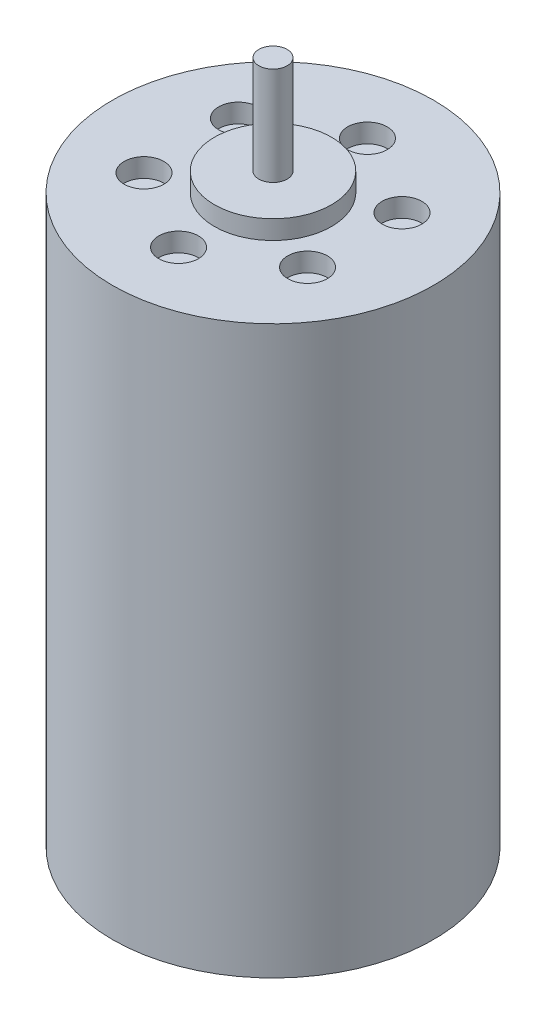
ISO-10303-21;
HEADER;
FILE_DESCRIPTION(('STEP AP214'),'2;1');
FILE_NAME('part.step','',(''),(''),'','','');
FILE_SCHEMA(('AUTOMOTIVE_DESIGN { 1 0 10303 214 1 1 1 1 }'));
ENDSEC;
DATA;
#1=APPLICATION_CONTEXT('core data for automotive mechanical design processes');
#2=APPLICATION_PROTOCOL_DEFINITION('international standard','automotive_design',2000,#1);
#3=PRODUCT_CONTEXT('',#1,'mechanical');
#4=PRODUCT('Part','Part','',(#3));
#5=PRODUCT_RELATED_PRODUCT_CATEGORY('part','',(#4));
#6=PRODUCT_DEFINITION_FORMATION('','',#4);
#7=PRODUCT_DEFINITION_CONTEXT('part definition',#1,'design');
#8=PRODUCT_DEFINITION('design','',#6,#7);
#9=PRODUCT_DEFINITION_SHAPE('','',#8);
#10=(LENGTH_UNIT() NAMED_UNIT(*) SI_UNIT(.MILLI.,.METRE.));
#11=(NAMED_UNIT(*) PLANE_ANGLE_UNIT() SI_UNIT($,.RADIAN.));
#12=(NAMED_UNIT(*) SI_UNIT($,.STERADIAN.) SOLID_ANGLE_UNIT());
#13=UNCERTAINTY_MEASURE_WITH_UNIT(LENGTH_MEASURE(1.E-05),#10,'distance_accuracy_value','');
#14=(GEOMETRIC_REPRESENTATION_CONTEXT(3) GLOBAL_UNCERTAINTY_ASSIGNED_CONTEXT((#13)) GLOBAL_UNIT_ASSIGNED_CONTEXT((#10,
#11,#12)) REPRESENTATION_CONTEXT('',''));
#15=CARTESIAN_POINT('',(0.,0.,0.));
#16=DIRECTION('',(0.,0.,1.));
#17=DIRECTION('',(1.,0.,0.));
#18=AXIS2_PLACEMENT_3D('',#15,#16,#17);
#19=CARTESIAN_POINT('',(0.,30.,0.));
#20=DIRECTION('',(0.,-1.,0.));
#21=DIRECTION('',(0.,0.,-1.));
#22=AXIS2_PLACEMENT_3D('',#19,#20,#21);
#23=CYLINDRICAL_SURFACE('',#22,8.5);
#24=CARTESIAN_POINT('',(0.,30.,0.));
#25=DIRECTION('',(0.,1.,0.));
#26=DIRECTION('',(0.,0.,1.));
#27=AXIS2_PLACEMENT_3D('',#24,#25,#26);
#28=CIRCLE('',#27,8.5);
#29=CARTESIAN_POINT('',(0.,30.,8.5));
#30=VERTEX_POINT('',#29);
#31=EDGE_CURVE('E59',#30,#30,#28,.T.);
#32=ORIENTED_EDGE('',*,*,#31,.F.);
#33=EDGE_LOOP('',(#32));
#34=FACE_BOUND('',#33,.T.);
#35=CARTESIAN_POINT('',(0.,0.,0.));
#36=DIRECTION('',(0.,1.,0.));
#37=DIRECTION('',(0.,0.,1.));
#38=AXIS2_PLACEMENT_3D('',#35,#36,#37);
#39=CIRCLE('',#38,8.5);
#40=CARTESIAN_POINT('',(0.,0.,8.5));
#41=VERTEX_POINT('',#40);
#42=EDGE_CURVE('E48',#41,#41,#39,.T.);
#43=ORIENTED_EDGE('',*,*,#42,.T.);
#44=EDGE_LOOP('',(#43));
#45=FACE_BOUND('',#44,.T.);
#46=ADVANCED_FACE('F45',(#34,#45),#23,.T.);
#47=CARTESIAN_POINT('',(0.,30.,0.));
#48=DIRECTION('',(0.,1.,0.));
#49=DIRECTION('',(0.,0.,1.));
#50=AXIS2_PLACEMENT_3D('',#47,#48,#49);
#51=PLANE('',#50);
#52=CARTESIAN_POINT('',(0.,30.,-5.));
#53=DIRECTION('',(0.,1.,0.));
#54=DIRECTION('',(0.,0.,1.));
#55=AXIS2_PLACEMENT_3D('',#52,#53,#54);
#56=CIRCLE('',#55,1.05);
#57=CARTESIAN_POINT('',(0.,30.,-3.95));
#58=VERTEX_POINT('',#57);
#59=EDGE_CURVE('E267',#58,#58,#56,.T.);
#60=ORIENTED_EDGE('',*,*,#59,.F.);
#61=EDGE_LOOP('',(#60));
#62=FACE_BOUND('',#61,.T.);
#63=CARTESIAN_POINT('',(-4.3301270189222,30.,-2.49999999999999));
#64=DIRECTION('',(0.,1.,0.));
#65=DIRECTION('',(0.,0.,1.));
#66=AXIS2_PLACEMENT_3D('',#63,#64,#65);
#67=CIRCLE('',#66,1.05);
#68=CARTESIAN_POINT('',(-4.3301270189222,30.,-1.44999999999999));
#69=VERTEX_POINT('',#68);
#70=EDGE_CURVE('E281',#69,#69,#67,.T.);
#71=ORIENTED_EDGE('',*,*,#70,.F.);
#72=EDGE_LOOP('',(#71));
#73=FACE_BOUND('',#72,.T.);
#74=CARTESIAN_POINT('',(-4.33012701892218,30.,2.50000000000002));
#75=DIRECTION('',(0.,1.,0.));
#76=DIRECTION('',(0.,0.,1.));
#77=AXIS2_PLACEMENT_3D('',#74,#75,#76);
#78=CIRCLE('',#77,1.05);
#79=CARTESIAN_POINT('',(-4.33012701892218,30.,3.55000000000002));
#80=VERTEX_POINT('',#79);
#81=EDGE_CURVE('E280',#80,#80,#78,.T.);
#82=ORIENTED_EDGE('',*,*,#81,.F.);
#83=EDGE_LOOP('',(#82));
#84=FACE_BOUND('',#83,.T.);
#85=CARTESIAN_POINT('',(0.,30.,5.));
#86=DIRECTION('',(0.,1.,0.));
#87=DIRECTION('',(0.,0.,1.));
#88=AXIS2_PLACEMENT_3D('',#85,#86,#87);
#89=CIRCLE('',#88,1.05);
#90=CARTESIAN_POINT('',(0.,30.,6.05));
#91=VERTEX_POINT('',#90);
#92=EDGE_CURVE('E304',#91,#91,#89,.T.);
#93=ORIENTED_EDGE('',*,*,#92,.F.);
#94=EDGE_LOOP('',(#93));
#95=FACE_BOUND('',#94,.T.);
#96=CARTESIAN_POINT('',(4.3301270189222,30.,2.49999999999999));
#97=DIRECTION('',(0.,1.,0.));
#98=DIRECTION('',(0.,0.,1.));
#99=AXIS2_PLACEMENT_3D('',#96,#97,#98);
#100=CIRCLE('',#99,1.05);
#101=CARTESIAN_POINT('',(4.3301270189222,30.,3.54999999999999));
#102=VERTEX_POINT('',#101);
#103=EDGE_CURVE('E296',#102,#102,#100,.T.);
#104=ORIENTED_EDGE('',*,*,#103,.F.);
#105=EDGE_LOOP('',(#104));
#106=FACE_BOUND('',#105,.T.);
#107=CARTESIAN_POINT('',(4.33012701892218,30.,-2.50000000000002));
#108=DIRECTION('',(0.,1.,0.));
#109=DIRECTION('',(0.,0.,1.));
#110=AXIS2_PLACEMENT_3D('',#107,#108,#109);
#111=CIRCLE('',#110,1.05);
#112=CARTESIAN_POINT('',(4.33012701892218,30.,-1.45000000000002));
#113=VERTEX_POINT('',#112);
#114=EDGE_CURVE('E288',#113,#113,#111,.T.);
#115=ORIENTED_EDGE('',*,*,#114,.F.);
#116=EDGE_LOOP('',(#115));
#117=FACE_BOUND('',#116,.T.);
#118=CARTESIAN_POINT('',(0.,30.,0.));
#119=DIRECTION('',(0.,1.,0.));
#120=DIRECTION('',(0.,0.,1.));
#121=AXIS2_PLACEMENT_3D('',#118,#119,#120);
#122=CIRCLE('',#121,3.1);
#123=CARTESIAN_POINT('',(0.,30.,3.1));
#124=VERTEX_POINT('',#123);
#125=EDGE_CURVE('E53',#124,#124,#122,.T.);
#126=ORIENTED_EDGE('',*,*,#125,.F.);
#127=EDGE_LOOP('',(#126));
#128=FACE_BOUND('',#127,.T.);
#129=ORIENTED_EDGE('',*,*,#31,.T.);
#130=EDGE_LOOP('',(#129));
#131=FACE_BOUND('',#130,.T.);
#132=ADVANCED_FACE('F80',(#62,#73,#84,#95,#106,#117,#128,#131),#51,.T.);
#133=CARTESIAN_POINT('',(0.,0.,0.));
#134=DIRECTION('',(0.,1.,0.));
#135=DIRECTION('',(0.,0.,1.));
#136=AXIS2_PLACEMENT_3D('',#133,#134,#135);
#137=PLANE('',#136);
#138=ORIENTED_EDGE('',*,*,#42,.F.);
#139=EDGE_LOOP('',(#138));
#140=FACE_BOUND('',#139,.T.);
#141=ADVANCED_FACE('F77',(#140),#137,.F.);
#142=CARTESIAN_POINT('',(0.,31.,0.));
#143=DIRECTION('',(0.,-1.,0.));
#144=DIRECTION('',(0.,0.,-1.));
#145=AXIS2_PLACEMENT_3D('',#142,#143,#144);
#146=CYLINDRICAL_SURFACE('',#145,3.1);
#147=CARTESIAN_POINT('',(0.,31.,0.));
#148=DIRECTION('',(0.,1.,0.));
#149=DIRECTION('',(0.,0.,1.));
#150=AXIS2_PLACEMENT_3D('',#147,#148,#149);
#151=CIRCLE('',#150,3.1);
#152=CARTESIAN_POINT('',(0.,31.,3.1));
#153=VERTEX_POINT('',#152);
#154=EDGE_CURVE('E65',#153,#153,#151,.T.);
#155=ORIENTED_EDGE('',*,*,#154,.F.);
#156=EDGE_LOOP('',(#155));
#157=FACE_BOUND('',#156,.T.);
#158=ORIENTED_EDGE('',*,*,#125,.T.);
#159=EDGE_LOOP('',(#158));
#160=FACE_BOUND('',#159,.T.);
#161=ADVANCED_FACE('F79',(#157,#160),#146,.T.);
#162=CARTESIAN_POINT('',(0.,31.,0.));
#163=DIRECTION('',(0.,1.,0.));
#164=DIRECTION('',(0.,0.,1.));
#165=AXIS2_PLACEMENT_3D('',#162,#163,#164);
#166=PLANE('',#165);
#167=CARTESIAN_POINT('',(0.,31.,0.));
#168=DIRECTION('',(0.,1.,0.));
#169=DIRECTION('',(0.,0.,1.));
#170=AXIS2_PLACEMENT_3D('',#167,#168,#169);
#171=CIRCLE('',#170,0.75);
#172=CARTESIAN_POINT('',(0.,31.,0.75));
#173=VERTEX_POINT('',#172);
#174=EDGE_CURVE('E10',#173,#173,#171,.T.);
#175=ORIENTED_EDGE('',*,*,#174,.F.);
#176=EDGE_LOOP('',(#175));
#177=FACE_BOUND('',#176,.T.);
#178=ORIENTED_EDGE('',*,*,#154,.T.);
#179=EDGE_LOOP('',(#178));
#180=FACE_BOUND('',#179,.T.);
#181=ADVANCED_FACE('F85',(#177,#180),#166,.T.);
#182=CARTESIAN_POINT('',(0.,36.2,0.));
#183=DIRECTION('',(0.,-1.,0.));
#184=DIRECTION('',(0.,0.,-1.));
#185=AXIS2_PLACEMENT_3D('',#182,#183,#184);
#186=CYLINDRICAL_SURFACE('',#185,0.75);
#187=CARTESIAN_POINT('',(0.,36.2,0.));
#188=DIRECTION('',(0.,1.,0.));
#189=DIRECTION('',(0.,0.,1.));
#190=AXIS2_PLACEMENT_3D('',#187,#188,#189);
#191=CIRCLE('',#190,0.75);
#192=CARTESIAN_POINT('',(0.,36.2,0.75));
#193=VERTEX_POINT('',#192);
#194=EDGE_CURVE('E63',#193,#193,#191,.T.);
#195=ORIENTED_EDGE('',*,*,#194,.F.);
#196=EDGE_LOOP('',(#195));
#197=FACE_BOUND('',#196,.T.);
#198=ORIENTED_EDGE('',*,*,#174,.T.);
#199=EDGE_LOOP('',(#198));
#200=FACE_BOUND('',#199,.T.);
#201=ADVANCED_FACE('F122',(#197,#200),#186,.T.);
#202=CARTESIAN_POINT('',(0.,36.2,0.));
#203=DIRECTION('',(0.,1.,0.));
#204=DIRECTION('',(0.,0.,1.));
#205=AXIS2_PLACEMENT_3D('',#202,#203,#204);
#206=PLANE('',#205);
#207=ORIENTED_EDGE('',*,*,#194,.T.);
#208=EDGE_LOOP('',(#207));
#209=FACE_BOUND('',#208,.T.);
#210=ADVANCED_FACE('F132',(#209),#206,.T.);
#211=CARTESIAN_POINT('',(4.33012701892218,29.,-2.50000000000002));
#212=DIRECTION('',(0.,1.,0.));
#213=DIRECTION('',(0.,0.,1.));
#214=AXIS2_PLACEMENT_3D('',#211,#212,#213);
#215=CYLINDRICAL_SURFACE('',#214,1.05);
#216=CARTESIAN_POINT('',(4.33012701892218,29.,-2.50000000000002));
#217=DIRECTION('',(0.,1.,0.));
#218=DIRECTION('',(0.,0.,1.));
#219=AXIS2_PLACEMENT_3D('',#216,#217,#218);
#220=CIRCLE('',#219,1.05);
#221=CARTESIAN_POINT('',(4.33012701892218,29.,-1.45000000000002));
#222=VERTEX_POINT('',#221);
#223=EDGE_CURVE('E273',#222,#222,#220,.T.);
#224=ORIENTED_EDGE('',*,*,#223,.F.);
#225=EDGE_LOOP('',(#224));
#226=FACE_BOUND('',#225,.T.);
#227=ORIENTED_EDGE('',*,*,#114,.T.);
#228=EDGE_LOOP('',(#227));
#229=FACE_BOUND('',#228,.T.);
#230=ADVANCED_FACE('F141',(#226,#229),#215,.F.);
#231=CARTESIAN_POINT('',(4.33012701892218,29.,-2.50000000000002));
#232=DIRECTION('',(0.,1.,0.));
#233=DIRECTION('',(0.,0.,1.));
#234=AXIS2_PLACEMENT_3D('',#231,#232,#233);
#235=PLANE('',#234);
#236=ORIENTED_EDGE('',*,*,#223,.T.);
#237=EDGE_LOOP('',(#236));
#238=FACE_BOUND('',#237,.T.);
#239=ADVANCED_FACE('F150',(#238),#235,.T.);
#240=CARTESIAN_POINT('',(4.3301270189222,29.,2.49999999999999));
#241=DIRECTION('',(0.,1.,0.));
#242=DIRECTION('',(0.,0.,1.));
#243=AXIS2_PLACEMENT_3D('',#240,#241,#242);
#244=CYLINDRICAL_SURFACE('',#243,1.05);
#245=CARTESIAN_POINT('',(4.3301270189222,29.,2.49999999999999));
#246=DIRECTION('',(0.,1.,0.));
#247=DIRECTION('',(0.,0.,1.));
#248=AXIS2_PLACEMENT_3D('',#245,#246,#247);
#249=CIRCLE('',#248,1.05);
#250=CARTESIAN_POINT('',(4.3301270189222,29.,3.54999999999999));
#251=VERTEX_POINT('',#250);
#252=EDGE_CURVE('E292',#251,#251,#249,.T.);
#253=ORIENTED_EDGE('',*,*,#252,.F.);
#254=EDGE_LOOP('',(#253));
#255=FACE_BOUND('',#254,.T.);
#256=ORIENTED_EDGE('',*,*,#103,.T.);
#257=EDGE_LOOP('',(#256));
#258=FACE_BOUND('',#257,.T.);
#259=ADVANCED_FACE('F160',(#255,#258),#244,.F.);
#260=CARTESIAN_POINT('',(4.3301270189222,29.,2.49999999999999));
#261=DIRECTION('',(0.,1.,0.));
#262=DIRECTION('',(0.,0.,1.));
#263=AXIS2_PLACEMENT_3D('',#260,#261,#262);
#264=PLANE('',#263);
#265=ORIENTED_EDGE('',*,*,#252,.T.);
#266=EDGE_LOOP('',(#265));
#267=FACE_BOUND('',#266,.T.);
#268=ADVANCED_FACE('F170',(#267),#264,.T.);
#269=CARTESIAN_POINT('',(0.,29.,5.));
#270=DIRECTION('',(0.,1.,0.));
#271=DIRECTION('',(0.,0.,1.));
#272=AXIS2_PLACEMENT_3D('',#269,#270,#271);
#273=CYLINDRICAL_SURFACE('',#272,1.05);
#274=CARTESIAN_POINT('',(0.,29.,5.));
#275=DIRECTION('',(0.,1.,0.));
#276=DIRECTION('',(0.,0.,1.));
#277=AXIS2_PLACEMENT_3D('',#274,#275,#276);
#278=CIRCLE('',#277,1.05);
#279=CARTESIAN_POINT('',(0.,29.,6.05));
#280=VERTEX_POINT('',#279);
#281=EDGE_CURVE('E300',#280,#280,#278,.T.);
#282=ORIENTED_EDGE('',*,*,#281,.F.);
#283=EDGE_LOOP('',(#282));
#284=FACE_BOUND('',#283,.T.);
#285=ORIENTED_EDGE('',*,*,#92,.T.);
#286=EDGE_LOOP('',(#285));
#287=FACE_BOUND('',#286,.T.);
#288=ADVANCED_FACE('F180',(#284,#287),#273,.F.);
#289=CARTESIAN_POINT('',(0.,29.,5.));
#290=DIRECTION('',(0.,1.,0.));
#291=DIRECTION('',(0.,0.,1.));
#292=AXIS2_PLACEMENT_3D('',#289,#290,#291);
#293=PLANE('',#292);
#294=ORIENTED_EDGE('',*,*,#281,.T.);
#295=EDGE_LOOP('',(#294));
#296=FACE_BOUND('',#295,.T.);
#297=ADVANCED_FACE('F190',(#296),#293,.T.);
#298=CARTESIAN_POINT('',(-4.33012701892218,29.,2.50000000000002));
#299=DIRECTION('',(0.,1.,0.));
#300=DIRECTION('',(0.,0.,1.));
#301=AXIS2_PLACEMENT_3D('',#298,#299,#300);
#302=CYLINDRICAL_SURFACE('',#301,1.05);
#303=CARTESIAN_POINT('',(-4.33012701892218,29.,2.50000000000002));
#304=DIRECTION('',(0.,1.,0.));
#305=DIRECTION('',(0.,0.,1.));
#306=AXIS2_PLACEMENT_3D('',#303,#304,#305);
#307=CIRCLE('',#306,1.05);
#308=CARTESIAN_POINT('',(-4.33012701892218,29.,3.55000000000002));
#309=VERTEX_POINT('',#308);
#310=EDGE_CURVE('E308',#309,#309,#307,.T.);
#311=ORIENTED_EDGE('',*,*,#310,.F.);
#312=EDGE_LOOP('',(#311));
#313=FACE_BOUND('',#312,.T.);
#314=ORIENTED_EDGE('',*,*,#81,.T.);
#315=EDGE_LOOP('',(#314));
#316=FACE_BOUND('',#315,.T.);
#317=ADVANCED_FACE('F200',(#313,#316),#302,.F.);
#318=CARTESIAN_POINT('',(-4.33012701892218,29.,2.50000000000002));
#319=DIRECTION('',(0.,1.,0.));
#320=DIRECTION('',(0.,0.,1.));
#321=AXIS2_PLACEMENT_3D('',#318,#319,#320);
#322=PLANE('',#321);
#323=ORIENTED_EDGE('',*,*,#310,.T.);
#324=EDGE_LOOP('',(#323));
#325=FACE_BOUND('',#324,.T.);
#326=ADVANCED_FACE('F210',(#325),#322,.T.);
#327=CARTESIAN_POINT('',(-4.3301270189222,29.,-2.49999999999999));
#328=DIRECTION('',(0.,1.,0.));
#329=DIRECTION('',(0.,0.,1.));
#330=AXIS2_PLACEMENT_3D('',#327,#328,#329);
#331=CYLINDRICAL_SURFACE('',#330,1.05);
#332=CARTESIAN_POINT('',(-4.3301270189222,29.,-2.49999999999999));
#333=DIRECTION('',(0.,1.,0.));
#334=DIRECTION('',(0.,0.,1.));
#335=AXIS2_PLACEMENT_3D('',#332,#333,#334);
#336=CIRCLE('',#335,1.05);
#337=CARTESIAN_POINT('',(-4.3301270189222,29.,-1.44999999999999));
#338=VERTEX_POINT('',#337);
#339=EDGE_CURVE('E276',#338,#338,#336,.T.);
#340=ORIENTED_EDGE('',*,*,#339,.F.);
#341=EDGE_LOOP('',(#340));
#342=FACE_BOUND('',#341,.T.);
#343=ORIENTED_EDGE('',*,*,#70,.T.);
#344=EDGE_LOOP('',(#343));
#345=FACE_BOUND('',#344,.T.);
#346=ADVANCED_FACE('F220',(#342,#345),#331,.F.);
#347=CARTESIAN_POINT('',(-4.3301270189222,29.,-2.49999999999999));
#348=DIRECTION('',(0.,1.,0.));
#349=DIRECTION('',(0.,0.,1.));
#350=AXIS2_PLACEMENT_3D('',#347,#348,#349);
#351=PLANE('',#350);
#352=ORIENTED_EDGE('',*,*,#339,.T.);
#353=EDGE_LOOP('',(#352));
#354=FACE_BOUND('',#353,.T.);
#355=ADVANCED_FACE('F230',(#354),#351,.T.);
#356=CARTESIAN_POINT('',(0.,29.,-5.));
#357=DIRECTION('',(0.,1.,0.));
#358=DIRECTION('',(0.,0.,1.));
#359=AXIS2_PLACEMENT_3D('',#356,#357,#358);
#360=CYLINDRICAL_SURFACE('',#359,1.05);
#361=CARTESIAN_POINT('',(0.,29.,-5.));
#362=DIRECTION('',(0.,1.,0.));
#363=DIRECTION('',(0.,0.,1.));
#364=AXIS2_PLACEMENT_3D('',#361,#362,#363);
#365=CIRCLE('',#364,1.05);
#366=CARTESIAN_POINT('',(0.,29.,-3.95));
#367=VERTEX_POINT('',#366);
#368=EDGE_CURVE('E265',#367,#367,#365,.T.);
#369=ORIENTED_EDGE('',*,*,#368,.F.);
#370=EDGE_LOOP('',(#369));
#371=FACE_BOUND('',#370,.T.);
#372=ORIENTED_EDGE('',*,*,#59,.T.);
#373=EDGE_LOOP('',(#372));
#374=FACE_BOUND('',#373,.T.);
#375=ADVANCED_FACE('F240',(#371,#374),#360,.F.);
#376=CARTESIAN_POINT('',(0.,29.,-5.));
#377=DIRECTION('',(0.,1.,0.));
#378=DIRECTION('',(0.,0.,1.));
#379=AXIS2_PLACEMENT_3D('',#376,#377,#378);
#380=PLANE('',#379);
#381=ORIENTED_EDGE('',*,*,#368,.T.);
#382=EDGE_LOOP('',(#381));
#383=FACE_BOUND('',#382,.T.);
#384=ADVANCED_FACE('F250',(#383),#380,.T.);
#385=CLOSED_SHELL('',(#46,#132,#141,#161,#181,#201,#210,#230,#239,#259,#268,#288,#297,#317,#326,
#346,#355,#375,#384));
#386=MANIFOLD_SOLID_BREP('B2',#385);
#387=ADVANCED_BREP_SHAPE_REPRESENTATION('',(#18,#386),#14);
#388=SHAPE_DEFINITION_REPRESENTATION(#9,#387);
ENDSEC;
END-ISO-10303-21;
